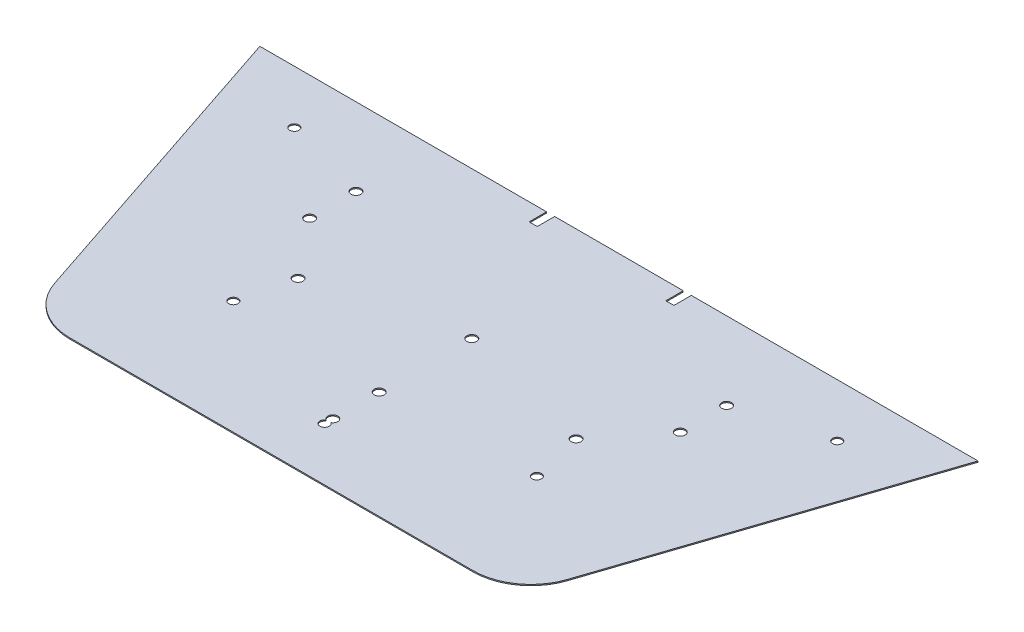
ISO-10303-21;
HEADER;
FILE_DESCRIPTION(('STEP AP214'),'2;1');
FILE_NAME('part.step','',(''),(''),'','','');
FILE_SCHEMA(('AUTOMOTIVE_DESIGN { 1 0 10303 214 1 1 1 1 }'));
ENDSEC;
DATA;
#1=APPLICATION_CONTEXT('core data for automotive mechanical design processes');
#2=APPLICATION_PROTOCOL_DEFINITION('international standard','automotive_design',2000,#1);
#3=PRODUCT_CONTEXT('',#1,'mechanical');
#4=PRODUCT('Part','Part','',(#3));
#5=PRODUCT_RELATED_PRODUCT_CATEGORY('part','',(#4));
#6=PRODUCT_DEFINITION_FORMATION('','',#4);
#7=PRODUCT_DEFINITION_CONTEXT('part definition',#1,'design');
#8=PRODUCT_DEFINITION('design','',#6,#7);
#9=PRODUCT_DEFINITION_SHAPE('','',#8);
#10=(LENGTH_UNIT() NAMED_UNIT(*) SI_UNIT(.MILLI.,.METRE.));
#11=(NAMED_UNIT(*) PLANE_ANGLE_UNIT() SI_UNIT($,.RADIAN.));
#12=(NAMED_UNIT(*) SI_UNIT($,.STERADIAN.) SOLID_ANGLE_UNIT());
#13=UNCERTAINTY_MEASURE_WITH_UNIT(LENGTH_MEASURE(1.E-05),#10,'distance_accuracy_value','');
#14=(GEOMETRIC_REPRESENTATION_CONTEXT(3) GLOBAL_UNCERTAINTY_ASSIGNED_CONTEXT((#13)) GLOBAL_UNIT_ASSIGNED_CONTEXT((#10,
#11,#12)) REPRESENTATION_CONTEXT('',''));
#15=CARTESIAN_POINT('',(0.,0.,0.));
#16=DIRECTION('',(0.,0.,1.));
#17=DIRECTION('',(1.,0.,0.));
#18=AXIS2_PLACEMENT_3D('',#15,#16,#17);
#19=CARTESIAN_POINT('',(0.,81.1999999999999,900.));
#20=DIRECTION('',(0.,0.,-1.));
#21=DIRECTION('',(-1.,0.,0.));
#22=AXIS2_PLACEMENT_3D('',#19,#20,#21);
#23=PLANE('',#22);
#24=DIRECTION('',(1.,0.,0.));
#25=VECTOR('',#24,1.);
#26=CARTESIAN_POINT('',(0.,80.1999999999999,900.));
#27=LINE('',#26,#25);
#28=CARTESIAN_POINT('',(-173.962038997194,80.1999999999999,900.));
#29=VERTEX_POINT('',#28);
#30=CARTESIAN_POINT('',(173.962038997194,80.1999999999999,900.));
#31=VERTEX_POINT('',#30);
#32=EDGE_CURVE('E207',#29,#31,#27,.T.);
#33=ORIENTED_EDGE('',*,*,#32,.T.);
#34=DIRECTION('',(0.,-1.,0.));
#35=VECTOR('',#34,1.);
#36=CARTESIAN_POINT('',(173.962038997194,81.1999999999999,900.));
#37=LINE('',#36,#35);
#38=CARTESIAN_POINT('',(173.962038997194,81.1999999999999,900.));
#39=VERTEX_POINT('',#38);
#40=EDGE_CURVE('E52',#39,#31,#37,.T.);
#41=ORIENTED_EDGE('',*,*,#40,.F.);
#42=DIRECTION('',(1.,0.,0.));
#43=VECTOR('',#42,1.);
#44=CARTESIAN_POINT('',(0.,81.1999999999999,900.));
#45=LINE('',#44,#43);
#46=CARTESIAN_POINT('',(-173.962038997194,81.1999999999999,900.));
#47=VERTEX_POINT('',#46);
#48=EDGE_CURVE('E447',#47,#39,#45,.T.);
#49=ORIENTED_EDGE('',*,*,#48,.F.);
#50=DIRECTION('',(0.,-1.,0.));
#51=VECTOR('',#50,1.);
#52=CARTESIAN_POINT('',(-173.962038997194,81.1999999999999,900.));
#53=LINE('',#52,#51);
#54=EDGE_CURVE('E187',#47,#29,#53,.T.);
#55=ORIENTED_EDGE('',*,*,#54,.T.);
#56=EDGE_LOOP('',(#33,#41,#49,#55));
#57=FACE_BOUND('',#56,.T.);
#58=ADVANCED_FACE('F43',(#57),#23,.F.);
#59=CARTESIAN_POINT('',(173.962038997194,81.1999999999999,850.));
#60=DIRECTION('',(0.,-1.,0.));
#61=DIRECTION('',(0.,0.,-1.));
#62=AXIS2_PLACEMENT_3D('',#59,#60,#61);
#63=CYLINDRICAL_SURFACE('',#62,50.0000000000002);
#64=CARTESIAN_POINT('',(173.962038997194,80.1999999999999,850.));
#65=DIRECTION('',(0.,1.,0.));
#66=DIRECTION('',(0.,0.,1.));
#67=AXIS2_PLACEMENT_3D('',#64,#65,#66);
#68=CIRCLE('',#67,50.0000000000002);
#69=CARTESIAN_POINT('',(221.39620389972,80.1999999999999,865.811388300842));
#70=VERTEX_POINT('',#69);
#71=EDGE_CURVE('E210',#31,#70,#68,.T.);
#72=ORIENTED_EDGE('',*,*,#71,.T.);
#73=DIRECTION('',(0.,-1.,0.));
#74=VECTOR('',#73,1.);
#75=CARTESIAN_POINT('',(221.39620389972,81.1999999999999,865.811388300842));
#76=LINE('',#75,#74);
#77=CARTESIAN_POINT('',(221.39620389972,81.1999999999999,865.811388300842));
#78=VERTEX_POINT('',#77);
#79=EDGE_CURVE('E260',#78,#70,#76,.T.);
#80=ORIENTED_EDGE('',*,*,#79,.F.);
#81=CARTESIAN_POINT('',(173.962038997194,81.1999999999999,850.));
#82=DIRECTION('',(0.,1.,0.));
#83=DIRECTION('',(0.,0.,1.));
#84=AXIS2_PLACEMENT_3D('',#81,#82,#83);
#85=CIRCLE('',#84,50.0000000000002);
#86=EDGE_CURVE('E128',#39,#78,#85,.T.);
#87=ORIENTED_EDGE('',*,*,#86,.F.);
#88=ORIENTED_EDGE('',*,*,#40,.T.);
#89=EDGE_LOOP('',(#72,#80,#87,#88));
#90=FACE_BOUND('',#89,.T.);
#91=ADVANCED_FACE('F306',(#90),#63,.T.);
#92=CARTESIAN_POINT('',(459.,81.1999999999999,153.));
#93=DIRECTION('',(-0.948683298050514,0.,-0.316227766016837));
#94=DIRECTION('',(-0.316227766016837,0.,0.948683298050514));
#95=AXIS2_PLACEMENT_3D('',#92,#93,#94);
#96=PLANE('',#95);
#97=DIRECTION('',(0.316227766016837,0.,-0.948683298050514));
#98=VECTOR('',#97,1.);
#99=CARTESIAN_POINT('',(459.,80.1999999999999,153.));
#100=LINE('',#99,#98);
#101=CARTESIAN_POINT('',(310.,80.1999999999999,600.));
#102=VERTEX_POINT('',#101);
#103=EDGE_CURVE('E212',#70,#102,#100,.T.);
#104=ORIENTED_EDGE('',*,*,#103,.T.);
#105=DIRECTION('',(0.,-1.,0.));
#106=VECTOR('',#105,1.);
#107=CARTESIAN_POINT('',(310.,81.1999999999999,600.));
#108=LINE('',#107,#106);
#109=CARTESIAN_POINT('',(310.,81.1999999999999,600.));
#110=VERTEX_POINT('',#109);
#111=EDGE_CURVE('E257',#110,#102,#108,.T.);
#112=ORIENTED_EDGE('',*,*,#111,.F.);
#113=DIRECTION('',(0.316227766016837,0.,-0.948683298050514));
#114=VECTOR('',#113,1.);
#115=CARTESIAN_POINT('',(459.,81.1999999999999,153.));
#116=LINE('',#115,#114);
#117=EDGE_CURVE('E446',#78,#110,#116,.T.);
#118=ORIENTED_EDGE('',*,*,#117,.F.);
#119=ORIENTED_EDGE('',*,*,#79,.T.);
#120=EDGE_LOOP('',(#104,#112,#118,#119));
#121=FACE_BOUND('',#120,.T.);
#122=ADVANCED_FACE('F312',(#121),#96,.F.);
#123=CARTESIAN_POINT('',(1.07440937866951E-13,81.1999999999999,600.));
#124=DIRECTION('',(0.,0.,1.));
#125=DIRECTION('',(1.,0.,0.));
#126=AXIS2_PLACEMENT_3D('',#123,#124,#125);
#127=PLANE('',#126);
#128=DIRECTION('',(-1.,0.,0.));
#129=VECTOR('',#128,1.);
#130=CARTESIAN_POINT('',(1.07440937866951E-13,80.1999999999999,600.));
#131=LINE('',#130,#129);
#132=CARTESIAN_POINT('',(62.5,80.1999999999999,600.));
#133=VERTEX_POINT('',#132);
#134=EDGE_CURVE('E214',#102,#133,#131,.T.);
#135=ORIENTED_EDGE('',*,*,#134,.T.);
#136=DIRECTION('',(0.,-1.,0.));
#137=VECTOR('',#136,1.);
#138=CARTESIAN_POINT('',(62.5,81.1999999999999,600.));
#139=LINE('',#138,#137);
#140=CARTESIAN_POINT('',(62.5,81.1999999999999,600.));
#141=VERTEX_POINT('',#140);
#142=EDGE_CURVE('E254',#141,#133,#139,.T.);
#143=ORIENTED_EDGE('',*,*,#142,.F.);
#144=DIRECTION('',(-1.,0.,0.));
#145=VECTOR('',#144,1.);
#146=CARTESIAN_POINT('',(1.07440937866951E-13,81.1999999999999,600.));
#147=LINE('',#146,#145);
#148=EDGE_CURVE('E173',#110,#141,#147,.T.);
#149=ORIENTED_EDGE('',*,*,#148,.F.);
#150=ORIENTED_EDGE('',*,*,#111,.T.);
#151=EDGE_LOOP('',(#135,#143,#149,#150));
#152=FACE_BOUND('',#151,.T.);
#153=ADVANCED_FACE('F378',(#152),#127,.F.);
#154=CARTESIAN_POINT('',(62.5,81.1999999999999,0.));
#155=DIRECTION('',(1.,0.,0.));
#156=DIRECTION('',(0.,0.,-1.));
#157=AXIS2_PLACEMENT_3D('',#154,#155,#156);
#158=PLANE('',#157);
#159=DIRECTION('',(0.,0.,1.));
#160=VECTOR('',#159,1.);
#161=CARTESIAN_POINT('',(62.5,80.1999999999999,0.));
#162=LINE('',#161,#160);
#163=CARTESIAN_POINT('',(62.5,80.1999999999999,615.));
#164=VERTEX_POINT('',#163);
#165=EDGE_CURVE('E216',#133,#164,#162,.T.);
#166=ORIENTED_EDGE('',*,*,#165,.T.);
#167=DIRECTION('',(0.,-1.,0.));
#168=VECTOR('',#167,1.);
#169=CARTESIAN_POINT('',(62.5,81.1999999999999,615.));
#170=LINE('',#169,#168);
#171=CARTESIAN_POINT('',(62.5,81.1999999999999,615.));
#172=VERTEX_POINT('',#171);
#173=EDGE_CURVE('E251',#172,#164,#170,.T.);
#174=ORIENTED_EDGE('',*,*,#173,.F.);
#175=DIRECTION('',(0.,0.,1.));
#176=VECTOR('',#175,1.);
#177=CARTESIAN_POINT('',(62.5,81.1999999999999,0.));
#178=LINE('',#177,#176);
#179=EDGE_CURVE('E426',#141,#172,#178,.T.);
#180=ORIENTED_EDGE('',*,*,#179,.F.);
#181=ORIENTED_EDGE('',*,*,#142,.T.);
#182=EDGE_LOOP('',(#166,#174,#180,#181));
#183=FACE_BOUND('',#182,.T.);
#184=ADVANCED_FACE('F398',(#183),#158,.F.);
#185=CARTESIAN_POINT('',(0.,81.1999999999999,615.));
#186=DIRECTION('',(0.,0.,1.));
#187=DIRECTION('',(1.,0.,0.));
#188=AXIS2_PLACEMENT_3D('',#185,#186,#187);
#189=PLANE('',#188);
#190=DIRECTION('',(-1.,0.,0.));
#191=VECTOR('',#190,1.);
#192=CARTESIAN_POINT('',(0.,80.1999999999999,615.));
#193=LINE('',#192,#191);
#194=CARTESIAN_POINT('',(55.5,80.1999999999999,615.));
#195=VERTEX_POINT('',#194);
#196=EDGE_CURVE('E219',#164,#195,#193,.T.);
#197=ORIENTED_EDGE('',*,*,#196,.T.);
#198=DIRECTION('',(0.,-1.,0.));
#199=VECTOR('',#198,1.);
#200=CARTESIAN_POINT('',(55.5,81.1999999999999,615.));
#201=LINE('',#200,#199);
#202=CARTESIAN_POINT('',(55.5,81.1999999999999,615.));
#203=VERTEX_POINT('',#202);
#204=EDGE_CURVE('E248',#203,#195,#201,.T.);
#205=ORIENTED_EDGE('',*,*,#204,.F.);
#206=DIRECTION('',(-1.,0.,0.));
#207=VECTOR('',#206,1.);
#208=CARTESIAN_POINT('',(0.,81.1999999999999,615.));
#209=LINE('',#208,#207);
#210=EDGE_CURVE('E423',#172,#203,#209,.T.);
#211=ORIENTED_EDGE('',*,*,#210,.F.);
#212=ORIENTED_EDGE('',*,*,#173,.T.);
#213=EDGE_LOOP('',(#197,#205,#211,#212));
#214=FACE_BOUND('',#213,.T.);
#215=ADVANCED_FACE('F394',(#214),#189,.F.);
#216=CARTESIAN_POINT('',(55.5000000000009,81.1999999999999,1.11022302462516E-13));
#217=DIRECTION('',(-1.,0.,0.));
#218=DIRECTION('',(0.,0.,1.));
#219=AXIS2_PLACEMENT_3D('',#216,#217,#218);
#220=PLANE('',#219);
#221=DIRECTION('',(0.,0.,-1.));
#222=VECTOR('',#221,1.);
#223=CARTESIAN_POINT('',(55.5000000000009,80.1999999999999,1.11022302462516E-13));
#224=LINE('',#223,#222);
#225=CARTESIAN_POINT('',(55.5,80.1999999999999,600.));
#226=VERTEX_POINT('',#225);
#227=EDGE_CURVE('E221',#195,#226,#224,.T.);
#228=ORIENTED_EDGE('',*,*,#227,.T.);
#229=DIRECTION('',(0.,-1.,0.));
#230=VECTOR('',#229,1.);
#231=CARTESIAN_POINT('',(55.5,81.1999999999999,600.));
#232=LINE('',#231,#230);
#233=CARTESIAN_POINT('',(55.5,81.1999999999999,600.));
#234=VERTEX_POINT('',#233);
#235=EDGE_CURVE('E245',#234,#226,#232,.T.);
#236=ORIENTED_EDGE('',*,*,#235,.F.);
#237=DIRECTION('',(0.,0.,-1.));
#238=VECTOR('',#237,1.);
#239=CARTESIAN_POINT('',(55.5000000000009,81.1999999999999,1.11022302462516E-13));
#240=LINE('',#239,#238);
#241=EDGE_CURVE('E425',#203,#234,#240,.T.);
#242=ORIENTED_EDGE('',*,*,#241,.F.);
#243=ORIENTED_EDGE('',*,*,#204,.T.);
#244=EDGE_LOOP('',(#228,#236,#242,#243));
#245=FACE_BOUND('',#244,.T.);
#246=ADVANCED_FACE('F391',(#245),#220,.F.);
#247=CARTESIAN_POINT('',(-55.5,80.1999999999999,600.));
#248=VERTEX_POINT('',#247);
#249=EDGE_CURVE('E217',#226,#248,#131,.T.);
#250=ORIENTED_EDGE('',*,*,#249,.T.);
#251=DIRECTION('',(0.,-1.,0.));
#252=VECTOR('',#251,1.);
#253=CARTESIAN_POINT('',(-55.5,81.1999999999999,600.));
#254=LINE('',#253,#252);
#255=CARTESIAN_POINT('',(-55.5,81.1999999999999,600.));
#256=VERTEX_POINT('',#255);
#257=EDGE_CURVE('E243',#256,#248,#254,.T.);
#258=ORIENTED_EDGE('',*,*,#257,.F.);
#259=EDGE_CURVE('E172',#234,#256,#147,.T.);
#260=ORIENTED_EDGE('',*,*,#259,.F.);
#261=ORIENTED_EDGE('',*,*,#235,.T.);
#262=EDGE_LOOP('',(#250,#258,#260,#261));
#263=FACE_BOUND('',#262,.T.);
#264=ADVANCED_FACE('F379',(#263),#127,.F.);
#265=CARTESIAN_POINT('',(-55.5000000000009,81.1999999999999,1.11022302462516E-13));
#266=DIRECTION('',(-1.,0.,0.));
#267=DIRECTION('',(0.,0.,1.));
#268=AXIS2_PLACEMENT_3D('',#265,#266,#267);
#269=PLANE('',#268);
#270=DIRECTION('',(0.,0.,-1.));
#271=VECTOR('',#270,1.);
#272=CARTESIAN_POINT('',(-55.5000000000009,80.1999999999999,1.11022302462516E-13));
#273=LINE('',#272,#271);
#274=CARTESIAN_POINT('',(-55.5,80.1999999999999,615.));
#275=VERTEX_POINT('',#274);
#276=EDGE_CURVE('E223',#275,#248,#273,.T.);
#277=ORIENTED_EDGE('',*,*,#276,.F.);
#278=DIRECTION('',(0.,-1.,0.));
#279=VECTOR('',#278,1.);
#280=CARTESIAN_POINT('',(-55.5,81.1999999999999,615.));
#281=LINE('',#280,#279);
#282=CARTESIAN_POINT('',(-55.5,81.1999999999999,615.));
#283=VERTEX_POINT('',#282);
#284=EDGE_CURVE('E241',#283,#275,#281,.T.);
#285=ORIENTED_EDGE('',*,*,#284,.F.);
#286=DIRECTION('',(0.,0.,-1.));
#287=VECTOR('',#286,1.);
#288=CARTESIAN_POINT('',(-55.5000000000009,81.1999999999999,1.11022302462516E-13));
#289=LINE('',#288,#287);
#290=EDGE_CURVE('E431',#283,#256,#289,.T.);
#291=ORIENTED_EDGE('',*,*,#290,.T.);
#292=ORIENTED_EDGE('',*,*,#257,.T.);
#293=EDGE_LOOP('',(#277,#285,#291,#292));
#294=FACE_BOUND('',#293,.T.);
#295=ADVANCED_FACE('F386',(#294),#269,.T.);
#296=CARTESIAN_POINT('',(0.,81.1999999999999,615.));
#297=DIRECTION('',(0.,0.,-1.));
#298=DIRECTION('',(-1.,0.,0.));
#299=AXIS2_PLACEMENT_3D('',#296,#297,#298);
#300=PLANE('',#299);
#301=DIRECTION('',(1.,0.,0.));
#302=VECTOR('',#301,1.);
#303=CARTESIAN_POINT('',(0.,80.1999999999999,615.));
#304=LINE('',#303,#302);
#305=CARTESIAN_POINT('',(-62.5,80.1999999999999,615.));
#306=VERTEX_POINT('',#305);
#307=EDGE_CURVE('E226',#306,#275,#304,.T.);
#308=ORIENTED_EDGE('',*,*,#307,.F.);
#309=DIRECTION('',(0.,-1.,0.));
#310=VECTOR('',#309,1.);
#311=CARTESIAN_POINT('',(-62.5,81.1999999999999,615.));
#312=LINE('',#311,#310);
#313=CARTESIAN_POINT('',(-62.5,81.1999999999999,615.));
#314=VERTEX_POINT('',#313);
#315=EDGE_CURVE('E239',#314,#306,#312,.T.);
#316=ORIENTED_EDGE('',*,*,#315,.F.);
#317=DIRECTION('',(1.,0.,0.));
#318=VECTOR('',#317,1.);
#319=CARTESIAN_POINT('',(0.,81.1999999999999,615.));
#320=LINE('',#319,#318);
#321=EDGE_CURVE('E433',#314,#283,#320,.T.);
#322=ORIENTED_EDGE('',*,*,#321,.T.);
#323=ORIENTED_EDGE('',*,*,#284,.T.);
#324=EDGE_LOOP('',(#308,#316,#322,#323));
#325=FACE_BOUND('',#324,.T.);
#326=ADVANCED_FACE('F382',(#325),#300,.T.);
#327=CARTESIAN_POINT('',(-62.5,81.1999999999999,0.));
#328=DIRECTION('',(1.,0.,0.));
#329=DIRECTION('',(0.,0.,-1.));
#330=AXIS2_PLACEMENT_3D('',#327,#328,#329);
#331=PLANE('',#330);
#332=DIRECTION('',(0.,0.,1.));
#333=VECTOR('',#332,1.);
#334=CARTESIAN_POINT('',(-62.5,80.1999999999999,0.));
#335=LINE('',#334,#333);
#336=CARTESIAN_POINT('',(-62.5,80.1999999999999,600.));
#337=VERTEX_POINT('',#336);
#338=EDGE_CURVE('E229',#337,#306,#335,.T.);
#339=ORIENTED_EDGE('',*,*,#338,.F.);
#340=DIRECTION('',(0.,-1.,0.));
#341=VECTOR('',#340,1.);
#342=CARTESIAN_POINT('',(-62.5,81.1999999999999,600.));
#343=LINE('',#342,#341);
#344=CARTESIAN_POINT('',(-62.5,81.1999999999999,600.));
#345=VERTEX_POINT('',#344);
#346=EDGE_CURVE('E182',#345,#337,#343,.T.);
#347=ORIENTED_EDGE('',*,*,#346,.F.);
#348=DIRECTION('',(0.,0.,1.));
#349=VECTOR('',#348,1.);
#350=CARTESIAN_POINT('',(-62.5,81.1999999999999,0.));
#351=LINE('',#350,#349);
#352=EDGE_CURVE('E169',#345,#314,#351,.T.);
#353=ORIENTED_EDGE('',*,*,#352,.T.);
#354=ORIENTED_EDGE('',*,*,#315,.T.);
#355=EDGE_LOOP('',(#339,#347,#353,#354));
#356=FACE_BOUND('',#355,.T.);
#357=ADVANCED_FACE('F377',(#356),#331,.T.);
#358=CARTESIAN_POINT('',(-310.,80.1999999999999,600.));
#359=VERTEX_POINT('',#358);
#360=EDGE_CURVE('E178',#337,#359,#131,.T.);
#361=ORIENTED_EDGE('',*,*,#360,.T.);
#362=DIRECTION('',(0.,-1.,0.));
#363=VECTOR('',#362,1.);
#364=CARTESIAN_POINT('',(-310.,81.1999999999999,600.));
#365=LINE('',#364,#363);
#366=CARTESIAN_POINT('',(-310.,81.1999999999999,600.));
#367=VERTEX_POINT('',#366);
#368=EDGE_CURVE('E175',#367,#359,#365,.T.);
#369=ORIENTED_EDGE('',*,*,#368,.F.);
#370=EDGE_CURVE('E162',#345,#367,#147,.T.);
#371=ORIENTED_EDGE('',*,*,#370,.F.);
#372=ORIENTED_EDGE('',*,*,#346,.T.);
#373=EDGE_LOOP('',(#361,#369,#371,#372));
#374=FACE_BOUND('',#373,.T.);
#375=ADVANCED_FACE('F176',(#374),#127,.F.);
#376=CARTESIAN_POINT('',(-459.,81.1999999999999,153.));
#377=DIRECTION('',(-0.948683298050514,0.,0.316227766016838));
#378=DIRECTION('',(0.316227766016838,0.,0.948683298050514));
#379=AXIS2_PLACEMENT_3D('',#376,#377,#378);
#380=PLANE('',#379);
#381=DIRECTION('',(-0.316227766016838,0.,-0.948683298050514));
#382=VECTOR('',#381,1.);
#383=CARTESIAN_POINT('',(-459.,80.1999999999999,153.));
#384=LINE('',#383,#382);
#385=CARTESIAN_POINT('',(-221.39620389972,80.1999999999999,865.811388300842));
#386=VERTEX_POINT('',#385);
#387=EDGE_CURVE('E232',#386,#359,#384,.T.);
#388=ORIENTED_EDGE('',*,*,#387,.F.);
#389=DIRECTION('',(0.,-1.,0.));
#390=VECTOR('',#389,1.);
#391=CARTESIAN_POINT('',(-221.39620389972,81.1999999999999,865.811388300842));
#392=LINE('',#391,#390);
#393=CARTESIAN_POINT('',(-221.39620389972,81.1999999999999,865.811388300842));
#394=VERTEX_POINT('',#393);
#395=EDGE_CURVE('E183',#394,#386,#392,.T.);
#396=ORIENTED_EDGE('',*,*,#395,.F.);
#397=DIRECTION('',(-0.316227766016838,0.,-0.948683298050514));
#398=VECTOR('',#397,1.);
#399=CARTESIAN_POINT('',(-459.,81.1999999999999,153.));
#400=LINE('',#399,#398);
#401=EDGE_CURVE('E166',#394,#367,#400,.T.);
#402=ORIENTED_EDGE('',*,*,#401,.T.);
#403=ORIENTED_EDGE('',*,*,#368,.T.);
#404=EDGE_LOOP('',(#388,#396,#402,#403));
#405=FACE_BOUND('',#404,.T.);
#406=ADVANCED_FACE('F185',(#405),#380,.T.);
#407=CARTESIAN_POINT('',(-234.343444872569,81.1999999999999,645.875));
#408=DIRECTION('',(0.,-1.,0.));
#409=DIRECTION('',(0.,0.,-1.));
#410=AXIS2_PLACEMENT_3D('',#407,#408,#409);
#411=CYLINDRICAL_SURFACE('',#410,3.99999999999999);
#412=CARTESIAN_POINT('',(-234.343444872569,81.1999999999999,645.875));
#413=DIRECTION('',(0.,1.,0.));
#414=DIRECTION('',(0.,0.,1.));
#415=AXIS2_PLACEMENT_3D('',#412,#413,#414);
#416=CIRCLE('',#415,3.99999999999999);
#417=CARTESIAN_POINT('',(-234.343444872569,81.1999999999999,649.875));
#418=VERTEX_POINT('',#417);
#419=EDGE_CURVE('E451',#418,#418,#416,.T.);
#420=ORIENTED_EDGE('',*,*,#419,.T.);
#421=EDGE_LOOP('',(#420));
#422=FACE_BOUND('',#421,.T.);
#423=CARTESIAN_POINT('',(-234.343444872569,80.1999999999999,645.875));
#424=DIRECTION('',(0.,1.,0.));
#425=DIRECTION('',(0.,0.,1.));
#426=AXIS2_PLACEMENT_3D('',#423,#424,#425);
#427=CIRCLE('',#426,3.99999999999999);
#428=CARTESIAN_POINT('',(-234.343444872569,80.1999999999999,649.875));
#429=VERTEX_POINT('',#428);
#430=EDGE_CURVE('E204',#429,#429,#427,.T.);
#431=ORIENTED_EDGE('',*,*,#430,.F.);
#432=EDGE_LOOP('',(#431));
#433=FACE_BOUND('',#432,.T.);
#434=ADVANCED_FACE('F316',(#422,#433),#411,.F.);
#435=CARTESIAN_POINT('',(234.343444872569,81.1999999999999,645.875));
#436=DIRECTION('',(0.,-1.,0.));
#437=DIRECTION('',(0.,0.,-1.));
#438=AXIS2_PLACEMENT_3D('',#435,#436,#437);
#439=CYLINDRICAL_SURFACE('',#438,3.99999999999999);
#440=CARTESIAN_POINT('',(234.343444872569,81.1999999999999,645.875));
#441=DIRECTION('',(0.,1.,0.));
#442=DIRECTION('',(0.,0.,1.));
#443=AXIS2_PLACEMENT_3D('',#440,#441,#442);
#444=CIRCLE('',#443,3.99999999999999);
#445=CARTESIAN_POINT('',(234.343444872569,81.1999999999999,649.875));
#446=VERTEX_POINT('',#445);
#447=EDGE_CURVE('E454',#446,#446,#444,.T.);
#448=ORIENTED_EDGE('',*,*,#447,.T.);
#449=EDGE_LOOP('',(#448));
#450=FACE_BOUND('',#449,.T.);
#451=CARTESIAN_POINT('',(234.343444872569,80.1999999999999,645.875));
#452=DIRECTION('',(0.,1.,0.));
#453=DIRECTION('',(0.,0.,1.));
#454=AXIS2_PLACEMENT_3D('',#451,#452,#453);
#455=CIRCLE('',#454,3.99999999999999);
#456=CARTESIAN_POINT('',(234.343444872569,80.1999999999999,649.875));
#457=VERTEX_POINT('',#456);
#458=EDGE_CURVE('E201',#457,#457,#455,.T.);
#459=ORIENTED_EDGE('',*,*,#458,.F.);
#460=EDGE_LOOP('',(#459));
#461=FACE_BOUND('',#460,.T.);
#462=ADVANCED_FACE('F319',(#450,#461),#439,.F.);
#463=CARTESIAN_POINT('',(131.008124108823,81.1999999999999,801.865605122316));
#464=DIRECTION('',(0.,-1.,0.));
#465=DIRECTION('',(0.,0.,-1.));
#466=AXIS2_PLACEMENT_3D('',#463,#464,#465);
#467=CYLINDRICAL_SURFACE('',#466,3.99999999999999);
#468=CARTESIAN_POINT('',(131.008124108823,81.1999999999999,801.865605122316));
#469=DIRECTION('',(0.,1.,0.));
#470=DIRECTION('',(0.,0.,1.));
#471=AXIS2_PLACEMENT_3D('',#468,#469,#470);
#472=CIRCLE('',#471,3.99999999999999);
#473=CARTESIAN_POINT('',(131.008124108823,81.1999999999999,805.865605122316));
#474=VERTEX_POINT('',#473);
#475=EDGE_CURVE('E457',#474,#474,#472,.T.);
#476=ORIENTED_EDGE('',*,*,#475,.T.);
#477=EDGE_LOOP('',(#476));
#478=FACE_BOUND('',#477,.T.);
#479=CARTESIAN_POINT('',(131.008124108823,80.1999999999999,801.865605122316));
#480=DIRECTION('',(0.,1.,0.));
#481=DIRECTION('',(0.,0.,1.));
#482=AXIS2_PLACEMENT_3D('',#479,#480,#481);
#483=CIRCLE('',#482,3.99999999999999);
#484=CARTESIAN_POINT('',(131.008124108823,80.1999999999999,805.865605122316));
#485=VERTEX_POINT('',#484);
#486=EDGE_CURVE('E198',#485,#485,#483,.T.);
#487=ORIENTED_EDGE('',*,*,#486,.F.);
#488=EDGE_LOOP('',(#487));
#489=FACE_BOUND('',#488,.T.);
#490=ADVANCED_FACE('F323',(#478,#489),#467,.F.);
#491=CARTESIAN_POINT('',(0.,81.1999999999999,854.125));
#492=DIRECTION('',(0.,-1.,0.));
#493=DIRECTION('',(0.,0.,-1.));
#494=AXIS2_PLACEMENT_3D('',#491,#492,#493);
#495=CYLINDRICAL_SURFACE('',#494,4.);
#496=DIRECTION('',(0.,1.,0.));
#497=VECTOR('',#496,1.);
#498=CARTESIAN_POINT('',(2.07819512956209,76.1999999999998,850.707236842105));
#499=LINE('',#498,#497);
#500=CARTESIAN_POINT('',(2.0781951295621,80.1999999999999,850.707236842105));
#501=VERTEX_POINT('',#500);
#502=CARTESIAN_POINT('',(2.07819512956209,81.1999999999999,850.707236842105));
#503=VERTEX_POINT('',#502);
#504=EDGE_CURVE('E283',#501,#503,#499,.T.);
#505=ORIENTED_EDGE('',*,*,#504,.F.);
#506=CARTESIAN_POINT('',(0.,80.1999999999999,854.125));
#507=DIRECTION('',(0.,1.,0.));
#508=DIRECTION('',(0.,0.,1.));
#509=AXIS2_PLACEMENT_3D('',#506,#507,#508);
#510=CIRCLE('',#509,4.);
#511=CARTESIAN_POINT('',(-2.07819512956203,80.1999999999999,850.707236842105));
#512=VERTEX_POINT('',#511);
#513=EDGE_CURVE('E195',#512,#501,#510,.T.);
#514=ORIENTED_EDGE('',*,*,#513,.F.);
#515=DIRECTION('',(0.,1.,0.));
#516=VECTOR('',#515,1.);
#517=CARTESIAN_POINT('',(-2.07819512956199,76.1999999999998,850.707236842105));
#518=LINE('',#517,#516);
#519=CARTESIAN_POINT('',(-2.07819512956201,81.1999999999999,850.707236842105));
#520=VERTEX_POINT('',#519);
#521=EDGE_CURVE('E60',#520,#512,#518,.F.);
#522=ORIENTED_EDGE('',*,*,#521,.F.);
#523=CARTESIAN_POINT('',(0.,81.1999999999999,854.125));
#524=DIRECTION('',(0.,1.,0.));
#525=DIRECTION('',(0.,0.,1.));
#526=AXIS2_PLACEMENT_3D('',#523,#524,#525);
#527=CIRCLE('',#526,4.);
#528=EDGE_CURVE('E341',#520,#503,#527,.T.);
#529=ORIENTED_EDGE('',*,*,#528,.T.);
#530=EDGE_LOOP('',(#505,#514,#522,#529));
#531=FACE_BOUND('',#530,.T.);
#532=ADVANCED_FACE('F326',(#531),#495,.F.);
#533=CARTESIAN_POINT('',(-131.008124108823,81.1999999999999,801.865605122316));
#534=DIRECTION('',(0.,-1.,0.));
#535=DIRECTION('',(0.,0.,-1.));
#536=AXIS2_PLACEMENT_3D('',#533,#534,#535);
#537=CYLINDRICAL_SURFACE('',#536,4.00000000000005);
#538=CARTESIAN_POINT('',(-131.008124108823,81.1999999999999,801.865605122316));
#539=DIRECTION('',(0.,1.,0.));
#540=DIRECTION('',(0.,0.,1.));
#541=AXIS2_PLACEMENT_3D('',#538,#539,#540);
#542=CIRCLE('',#541,4.00000000000005);
#543=CARTESIAN_POINT('',(-131.008124108823,81.1999999999999,805.865605122316));
#544=VERTEX_POINT('',#543);
#545=EDGE_CURVE('E235',#544,#544,#542,.T.);
#546=ORIENTED_EDGE('',*,*,#545,.T.);
#547=EDGE_LOOP('',(#546));
#548=FACE_BOUND('',#547,.T.);
#549=CARTESIAN_POINT('',(-131.008124108823,80.1999999999999,801.865605122316));
#550=DIRECTION('',(0.,1.,0.));
#551=DIRECTION('',(0.,0.,1.));
#552=AXIS2_PLACEMENT_3D('',#549,#550,#551);
#553=CIRCLE('',#552,4.00000000000005);
#554=CARTESIAN_POINT('',(-131.008124108823,80.1999999999999,805.865605122316));
#555=VERTEX_POINT('',#554);
#556=EDGE_CURVE('E192',#555,#555,#553,.T.);
#557=ORIENTED_EDGE('',*,*,#556,.F.);
#558=EDGE_LOOP('',(#557));
#559=FACE_BOUND('',#558,.T.);
#560=ADVANCED_FACE('F45',(#548,#559),#537,.F.);
#561=CARTESIAN_POINT('',(-173.962038997194,81.1999999999999,850.));
#562=DIRECTION('',(0.,-1.,0.));
#563=DIRECTION('',(0.,0.,-1.));
#564=AXIS2_PLACEMENT_3D('',#561,#562,#563);
#565=CYLINDRICAL_SURFACE('',#564,50.0000000000002);
#566=CARTESIAN_POINT('',(-173.962038997194,80.1999999999999,850.));
#567=DIRECTION('',(0.,1.,0.));
#568=DIRECTION('',(0.,0.,1.));
#569=AXIS2_PLACEMENT_3D('',#566,#567,#568);
#570=CIRCLE('',#569,50.0000000000002);
#571=EDGE_CURVE('E119',#386,#29,#570,.T.);
#572=ORIENTED_EDGE('',*,*,#571,.T.);
#573=ORIENTED_EDGE('',*,*,#54,.F.);
#574=CARTESIAN_POINT('',(-173.962038997194,81.1999999999999,850.));
#575=DIRECTION('',(0.,1.,0.));
#576=DIRECTION('',(0.,0.,1.));
#577=AXIS2_PLACEMENT_3D('',#574,#575,#576);
#578=CIRCLE('',#577,50.0000000000002);
#579=EDGE_CURVE('E68',#394,#47,#578,.T.);
#580=ORIENTED_EDGE('',*,*,#579,.F.);
#581=ORIENTED_EDGE('',*,*,#395,.T.);
#582=EDGE_LOOP('',(#572,#573,#580,#581));
#583=FACE_BOUND('',#582,.T.);
#584=ADVANCED_FACE('F333',(#583),#565,.T.);
#585=CARTESIAN_POINT('',(0.,81.1999999999999,0.));
#586=DIRECTION('',(0.,1.,0.));
#587=DIRECTION('',(0.,0.,1.));
#588=AXIS2_PLACEMENT_3D('',#585,#586,#587);
#589=PLANE('',#588);
#590=CARTESIAN_POINT('',(-160.,81.1999999999999,706.999999999999));
#591=DIRECTION('',(0.,1.,0.));
#592=DIRECTION('',(0.,0.,1.));
#593=AXIS2_PLACEMENT_3D('',#590,#591,#592);
#594=CIRCLE('',#593,4.2500000000001);
#595=CARTESIAN_POINT('',(-160.,81.1999999999999,711.25));
#596=VERTEX_POINT('',#595);
#597=EDGE_CURVE('E466',#596,#596,#594,.T.);
#598=ORIENTED_EDGE('',*,*,#597,.F.);
#599=EDGE_LOOP('',(#598));
#600=FACE_BOUND('',#599,.T.);
#601=CARTESIAN_POINT('',(-120.,81.1999999999999,756.999999999999));
#602=DIRECTION('',(0.,1.,0.));
#603=DIRECTION('',(0.,0.,1.));
#604=AXIS2_PLACEMENT_3D('',#601,#602,#603);
#605=CIRCLE('',#604,4.24999999999995);
#606=CARTESIAN_POINT('',(-120.,81.1999999999999,761.249999999999));
#607=VERTEX_POINT('',#606);
#608=EDGE_CURVE('E473',#607,#607,#605,.T.);
#609=ORIENTED_EDGE('',*,*,#608,.F.);
#610=EDGE_LOOP('',(#609));
#611=FACE_BOUND('',#610,.T.);
#612=CARTESIAN_POINT('',(0.,81.1999999999999,806.999999999999));
#613=DIRECTION('',(0.,1.,0.));
#614=DIRECTION('',(0.,0.,1.));
#615=AXIS2_PLACEMENT_3D('',#612,#613,#614);
#616=CIRCLE('',#615,4.24999999999999);
#617=CARTESIAN_POINT('',(0.,81.1999999999999,811.249999999999));
#618=VERTEX_POINT('',#617);
#619=EDGE_CURVE('E469',#618,#618,#616,.T.);
#620=ORIENTED_EDGE('',*,*,#619,.F.);
#621=EDGE_LOOP('',(#620));
#622=FACE_BOUND('',#621,.T.);
#623=CARTESIAN_POINT('',(1.00396173123971E-13,81.1999999999999,846.999999999999));
#624=DIRECTION('',(0.,1.,0.));
#625=DIRECTION('',(0.,0.,1.));
#626=AXIS2_PLACEMENT_3D('',#623,#624,#625);
#627=CIRCLE('',#626,4.25000000000014);
#628=EDGE_CURVE('E467',#503,#520,#627,.T.);
#629=ORIENTED_EDGE('',*,*,#628,.F.);
#630=ORIENTED_EDGE('',*,*,#528,.F.);
#631=EDGE_LOOP('',(#629,#630));
#632=FACE_BOUND('',#631,.T.);
#633=CARTESIAN_POINT('',(0.,81.1999999999999,726.999999999999));
#634=DIRECTION('',(0.,1.,0.));
#635=DIRECTION('',(0.,0.,1.));
#636=AXIS2_PLACEMENT_3D('',#633,#634,#635);
#637=CIRCLE('',#636,4.24999999999994);
#638=CARTESIAN_POINT('',(0.,81.1999999999999,731.249999999999));
#639=VERTEX_POINT('',#638);
#640=EDGE_CURVE('E470',#639,#639,#637,.T.);
#641=ORIENTED_EDGE('',*,*,#640,.F.);
#642=EDGE_LOOP('',(#641));
#643=FACE_BOUND('',#642,.T.);
#644=CARTESIAN_POINT('',(120.,81.1999999999999,756.999999999999));
#645=DIRECTION('',(0.,1.,0.));
#646=DIRECTION('',(0.,0.,-1.));
#647=AXIS2_PLACEMENT_3D('',#644,#645,#646);
#648=CIRCLE('',#647,4.24999999999998);
#649=CARTESIAN_POINT('',(120.,81.1999999999999,752.749999999999));
#650=VERTEX_POINT('',#649);
#651=EDGE_CURVE('E483',#650,#650,#648,.T.);
#652=ORIENTED_EDGE('',*,*,#651,.F.);
#653=EDGE_LOOP('',(#652));
#654=FACE_BOUND('',#653,.T.);
#655=CARTESIAN_POINT('',(160.,81.1999999999999,706.999999999999));
#656=DIRECTION('',(0.,1.,0.));
#657=DIRECTION('',(0.,0.,-1.));
#658=AXIS2_PLACEMENT_3D('',#655,#656,#657);
#659=CIRCLE('',#658,4.25000000000005);
#660=CARTESIAN_POINT('',(160.,81.1999999999999,702.749999999999));
#661=VERTEX_POINT('',#660);
#662=EDGE_CURVE('E480',#661,#661,#659,.T.);
#663=ORIENTED_EDGE('',*,*,#662,.F.);
#664=EDGE_LOOP('',(#663));
#665=FACE_BOUND('',#664,.T.);
#666=CARTESIAN_POINT('',(160.,81.1999999999999,666.999999999999));
#667=DIRECTION('',(0.,1.,0.));
#668=DIRECTION('',(0.,0.,-1.));
#669=AXIS2_PLACEMENT_3D('',#666,#667,#668);
#670=CIRCLE('',#669,4.24999999999988);
#671=CARTESIAN_POINT('',(160.,81.1999999999999,662.75));
#672=VERTEX_POINT('',#671);
#673=EDGE_CURVE('E477',#672,#672,#670,.T.);
#674=ORIENTED_EDGE('',*,*,#673,.F.);
#675=EDGE_LOOP('',(#674));
#676=FACE_BOUND('',#675,.T.);
#677=CARTESIAN_POINT('',(-160.,81.1999999999999,666.999999999999));
#678=DIRECTION('',(0.,1.,0.));
#679=DIRECTION('',(0.,0.,1.));
#680=AXIS2_PLACEMENT_3D('',#677,#678,#679);
#681=CIRCLE('',#680,4.24999999999996);
#682=CARTESIAN_POINT('',(-160.,81.1999999999999,671.249999999999));
#683=VERTEX_POINT('',#682);
#684=EDGE_CURVE('E268',#683,#683,#681,.T.);
#685=ORIENTED_EDGE('',*,*,#684,.F.);
#686=EDGE_LOOP('',(#685));
#687=FACE_BOUND('',#686,.T.);
#688=ORIENTED_EDGE('',*,*,#545,.F.);
#689=EDGE_LOOP('',(#688));
#690=FACE_BOUND('',#689,.T.);
#691=ORIENTED_EDGE('',*,*,#475,.F.);
#692=EDGE_LOOP('',(#691));
#693=FACE_BOUND('',#692,.T.);
#694=ORIENTED_EDGE('',*,*,#447,.F.);
#695=EDGE_LOOP('',(#694));
#696=FACE_BOUND('',#695,.T.);
#697=ORIENTED_EDGE('',*,*,#419,.F.);
#698=EDGE_LOOP('',(#697));
#699=FACE_BOUND('',#698,.T.);
#700=ORIENTED_EDGE('',*,*,#48,.T.);
#701=ORIENTED_EDGE('',*,*,#86,.T.);
#702=ORIENTED_EDGE('',*,*,#117,.T.);
#703=ORIENTED_EDGE('',*,*,#148,.T.);
#704=ORIENTED_EDGE('',*,*,#179,.T.);
#705=ORIENTED_EDGE('',*,*,#210,.T.);
#706=ORIENTED_EDGE('',*,*,#241,.T.);
#707=ORIENTED_EDGE('',*,*,#259,.T.);
#708=ORIENTED_EDGE('',*,*,#290,.F.);
#709=ORIENTED_EDGE('',*,*,#321,.F.);
#710=ORIENTED_EDGE('',*,*,#352,.F.);
#711=ORIENTED_EDGE('',*,*,#370,.T.);
#712=ORIENTED_EDGE('',*,*,#401,.F.);
#713=ORIENTED_EDGE('',*,*,#579,.T.);
#714=EDGE_LOOP('',(#700,#701,#702,#703,#704,#705,#706,#707,#708,#709,#710,#711,#712,#713));
#715=FACE_BOUND('',#714,.T.);
#716=ADVANCED_FACE('F164',(#600,#611,#622,#632,#643,#654,#665,#676,#687,#690,#693,#696,#699,
#715),#589,.T.);
#717=CARTESIAN_POINT('',(0.,80.1999999999999,0.));
#718=DIRECTION('',(0.,1.,0.));
#719=DIRECTION('',(0.,0.,1.));
#720=AXIS2_PLACEMENT_3D('',#717,#718,#719);
#721=PLANE('',#720);
#722=CARTESIAN_POINT('',(-160.,80.1999999999999,706.999999999999));
#723=DIRECTION('',(0.,1.,0.));
#724=DIRECTION('',(0.,0.,1.));
#725=AXIS2_PLACEMENT_3D('',#722,#723,#724);
#726=CIRCLE('',#725,4.2500000000001);
#727=CARTESIAN_POINT('',(-160.,80.1999999999999,711.25));
#728=VERTEX_POINT('',#727);
#729=EDGE_CURVE('E47',#728,#728,#726,.T.);
#730=ORIENTED_EDGE('',*,*,#729,.T.);
#731=EDGE_LOOP('',(#730));
#732=FACE_BOUND('',#731,.T.);
#733=CARTESIAN_POINT('',(-120.,80.1999999999999,756.999999999999));
#734=DIRECTION('',(0.,1.,0.));
#735=DIRECTION('',(0.,0.,1.));
#736=AXIS2_PLACEMENT_3D('',#733,#734,#735);
#737=CIRCLE('',#736,4.24999999999995);
#738=CARTESIAN_POINT('',(-120.,80.1999999999999,761.249999999999));
#739=VERTEX_POINT('',#738);
#740=EDGE_CURVE('E282',#739,#739,#737,.T.);
#741=ORIENTED_EDGE('',*,*,#740,.T.);
#742=EDGE_LOOP('',(#741));
#743=FACE_BOUND('',#742,.T.);
#744=CARTESIAN_POINT('',(0.,80.1999999999999,806.999999999999));
#745=DIRECTION('',(0.,1.,0.));
#746=DIRECTION('',(0.,0.,1.));
#747=AXIS2_PLACEMENT_3D('',#744,#745,#746);
#748=CIRCLE('',#747,4.24999999999999);
#749=CARTESIAN_POINT('',(0.,80.1999999999999,811.249999999999));
#750=VERTEX_POINT('',#749);
#751=EDGE_CURVE('E280',#750,#750,#748,.T.);
#752=ORIENTED_EDGE('',*,*,#751,.T.);
#753=EDGE_LOOP('',(#752));
#754=FACE_BOUND('',#753,.T.);
#755=CARTESIAN_POINT('',(0.,80.1999999999999,726.999999999999));
#756=DIRECTION('',(0.,1.,0.));
#757=DIRECTION('',(0.,0.,1.));
#758=AXIS2_PLACEMENT_3D('',#755,#756,#757);
#759=CIRCLE('',#758,4.24999999999994);
#760=CARTESIAN_POINT('',(0.,80.1999999999999,731.249999999999));
#761=VERTEX_POINT('',#760);
#762=EDGE_CURVE('E277',#761,#761,#759,.T.);
#763=ORIENTED_EDGE('',*,*,#762,.T.);
#764=EDGE_LOOP('',(#763));
#765=FACE_BOUND('',#764,.T.);
#766=CARTESIAN_POINT('',(120.,80.1999999999999,756.999999999999));
#767=DIRECTION('',(0.,1.,0.));
#768=DIRECTION('',(0.,0.,1.));
#769=AXIS2_PLACEMENT_3D('',#766,#767,#768);
#770=CIRCLE('',#769,4.24999999999998);
#771=CARTESIAN_POINT('',(120.,80.1999999999999,761.249999999999));
#772=VERTEX_POINT('',#771);
#773=EDGE_CURVE('E274',#772,#772,#770,.T.);
#774=ORIENTED_EDGE('',*,*,#773,.T.);
#775=EDGE_LOOP('',(#774));
#776=FACE_BOUND('',#775,.T.);
#777=CARTESIAN_POINT('',(160.,80.1999999999999,706.999999999999));
#778=DIRECTION('',(0.,1.,0.));
#779=DIRECTION('',(0.,0.,1.));
#780=AXIS2_PLACEMENT_3D('',#777,#778,#779);
#781=CIRCLE('',#780,4.25000000000005);
#782=CARTESIAN_POINT('',(160.,80.1999999999999,711.25));
#783=VERTEX_POINT('',#782);
#784=EDGE_CURVE('E271',#783,#783,#781,.T.);
#785=ORIENTED_EDGE('',*,*,#784,.T.);
#786=EDGE_LOOP('',(#785));
#787=FACE_BOUND('',#786,.T.);
#788=CARTESIAN_POINT('',(160.,80.1999999999999,666.999999999999));
#789=DIRECTION('',(0.,1.,0.));
#790=DIRECTION('',(0.,0.,1.));
#791=AXIS2_PLACEMENT_3D('',#788,#789,#790);
#792=CIRCLE('',#791,4.24999999999988);
#793=CARTESIAN_POINT('',(160.,80.1999999999999,671.249999999999));
#794=VERTEX_POINT('',#793);
#795=EDGE_CURVE('E267',#794,#794,#792,.T.);
#796=ORIENTED_EDGE('',*,*,#795,.T.);
#797=EDGE_LOOP('',(#796));
#798=FACE_BOUND('',#797,.T.);
#799=CARTESIAN_POINT('',(-160.,80.1999999999999,666.999999999999));
#800=DIRECTION('',(0.,1.,0.));
#801=DIRECTION('',(0.,0.,1.));
#802=AXIS2_PLACEMENT_3D('',#799,#800,#801);
#803=CIRCLE('',#802,4.24999999999996);
#804=CARTESIAN_POINT('',(-160.,80.1999999999999,671.249999999999));
#805=VERTEX_POINT('',#804);
#806=EDGE_CURVE('E264',#805,#805,#803,.T.);
#807=ORIENTED_EDGE('',*,*,#806,.T.);
#808=EDGE_LOOP('',(#807));
#809=FACE_BOUND('',#808,.T.);
#810=ORIENTED_EDGE('',*,*,#556,.T.);
#811=EDGE_LOOP('',(#810));
#812=FACE_BOUND('',#811,.T.);
#813=ORIENTED_EDGE('',*,*,#513,.T.);
#814=CARTESIAN_POINT('',(1.00396173123971E-13,80.1999999999999,846.999999999999));
#815=DIRECTION('',(0.,1.,0.));
#816=DIRECTION('',(0.,0.,1.));
#817=AXIS2_PLACEMENT_3D('',#814,#815,#816);
#818=CIRCLE('',#817,4.25000000000014);
#819=EDGE_CURVE('E11',#501,#512,#818,.T.);
#820=ORIENTED_EDGE('',*,*,#819,.T.);
#821=EDGE_LOOP('',(#813,#820));
#822=FACE_BOUND('',#821,.T.);
#823=ORIENTED_EDGE('',*,*,#486,.T.);
#824=EDGE_LOOP('',(#823));
#825=FACE_BOUND('',#824,.T.);
#826=ORIENTED_EDGE('',*,*,#458,.T.);
#827=EDGE_LOOP('',(#826));
#828=FACE_BOUND('',#827,.T.);
#829=ORIENTED_EDGE('',*,*,#430,.T.);
#830=EDGE_LOOP('',(#829));
#831=FACE_BOUND('',#830,.T.);
#832=ORIENTED_EDGE('',*,*,#32,.F.);
#833=ORIENTED_EDGE('',*,*,#571,.F.);
#834=ORIENTED_EDGE('',*,*,#387,.T.);
#835=ORIENTED_EDGE('',*,*,#360,.F.);
#836=ORIENTED_EDGE('',*,*,#338,.T.);
#837=ORIENTED_EDGE('',*,*,#307,.T.);
#838=ORIENTED_EDGE('',*,*,#276,.T.);
#839=ORIENTED_EDGE('',*,*,#249,.F.);
#840=ORIENTED_EDGE('',*,*,#227,.F.);
#841=ORIENTED_EDGE('',*,*,#196,.F.);
#842=ORIENTED_EDGE('',*,*,#165,.F.);
#843=ORIENTED_EDGE('',*,*,#134,.F.);
#844=ORIENTED_EDGE('',*,*,#103,.F.);
#845=ORIENTED_EDGE('',*,*,#71,.F.);
#846=EDGE_LOOP('',(#832,#833,#834,#835,#836,#837,#838,#839,#840,#841,#842,#843,#844,#845));
#847=FACE_BOUND('',#846,.T.);
#848=ADVANCED_FACE('F290',(#732,#743,#754,#765,#776,#787,#798,#809,#812,#822,#825,#828,#831,
#847),#721,.F.);
#849=CARTESIAN_POINT('',(-160.,71.1999999999999,666.999999999999));
#850=DIRECTION('',(0.,1.,0.));
#851=DIRECTION('',(0.,0.,1.));
#852=AXIS2_PLACEMENT_3D('',#849,#850,#851);
#853=CYLINDRICAL_SURFACE('',#852,4.24999999999996);
#854=ORIENTED_EDGE('',*,*,#684,.T.);
#855=EDGE_LOOP('',(#854));
#856=FACE_BOUND('',#855,.T.);
#857=ORIENTED_EDGE('',*,*,#806,.F.);
#858=EDGE_LOOP('',(#857));
#859=FACE_BOUND('',#858,.T.);
#860=ADVANCED_FACE('F361',(#856,#859),#853,.F.);
#861=CARTESIAN_POINT('',(160.,71.1999999999999,666.999999999999));
#862=DIRECTION('',(0.,1.,0.));
#863=DIRECTION('',(0.,0.,1.));
#864=AXIS2_PLACEMENT_3D('',#861,#862,#863);
#865=CYLINDRICAL_SURFACE('',#864,4.24999999999988);
#866=ORIENTED_EDGE('',*,*,#673,.T.);
#867=EDGE_LOOP('',(#866));
#868=FACE_BOUND('',#867,.T.);
#869=ORIENTED_EDGE('',*,*,#795,.F.);
#870=EDGE_LOOP('',(#869));
#871=FACE_BOUND('',#870,.T.);
#872=ADVANCED_FACE('F364',(#868,#871),#865,.F.);
#873=CARTESIAN_POINT('',(160.,71.1999999999999,706.999999999999));
#874=DIRECTION('',(0.,1.,0.));
#875=DIRECTION('',(0.,0.,1.));
#876=AXIS2_PLACEMENT_3D('',#873,#874,#875);
#877=CYLINDRICAL_SURFACE('',#876,4.25000000000005);
#878=ORIENTED_EDGE('',*,*,#662,.T.);
#879=EDGE_LOOP('',(#878));
#880=FACE_BOUND('',#879,.T.);
#881=ORIENTED_EDGE('',*,*,#784,.F.);
#882=EDGE_LOOP('',(#881));
#883=FACE_BOUND('',#882,.T.);
#884=ADVANCED_FACE('F523',(#880,#883),#877,.F.);
#885=CARTESIAN_POINT('',(120.,71.1999999999999,756.999999999999));
#886=DIRECTION('',(0.,1.,0.));
#887=DIRECTION('',(0.,0.,1.));
#888=AXIS2_PLACEMENT_3D('',#885,#886,#887);
#889=CYLINDRICAL_SURFACE('',#888,4.24999999999998);
#890=ORIENTED_EDGE('',*,*,#651,.T.);
#891=EDGE_LOOP('',(#890));
#892=FACE_BOUND('',#891,.T.);
#893=ORIENTED_EDGE('',*,*,#773,.F.);
#894=EDGE_LOOP('',(#893));
#895=FACE_BOUND('',#894,.T.);
#896=ADVANCED_FACE('F357',(#892,#895),#889,.F.);
#897=CARTESIAN_POINT('',(0.,71.1999999999999,726.999999999999));
#898=DIRECTION('',(0.,1.,0.));
#899=DIRECTION('',(0.,0.,1.));
#900=AXIS2_PLACEMENT_3D('',#897,#898,#899);
#901=CYLINDRICAL_SURFACE('',#900,4.24999999999994);
#902=ORIENTED_EDGE('',*,*,#640,.T.);
#903=EDGE_LOOP('',(#902));
#904=FACE_BOUND('',#903,.T.);
#905=ORIENTED_EDGE('',*,*,#762,.F.);
#906=EDGE_LOOP('',(#905));
#907=FACE_BOUND('',#906,.T.);
#908=ADVANCED_FACE('F349',(#904,#907),#901,.F.);
#909=CARTESIAN_POINT('',(1.00396173123971E-13,71.1999999999999,846.999999999999));
#910=DIRECTION('',(0.,1.,0.));
#911=DIRECTION('',(0.,0.,1.));
#912=AXIS2_PLACEMENT_3D('',#909,#910,#911);
#913=CYLINDRICAL_SURFACE('',#912,4.25000000000014);
#914=ORIENTED_EDGE('',*,*,#504,.T.);
#915=ORIENTED_EDGE('',*,*,#628,.T.);
#916=ORIENTED_EDGE('',*,*,#521,.T.);
#917=ORIENTED_EDGE('',*,*,#819,.F.);
#918=EDGE_LOOP('',(#914,#915,#916,#917));
#919=FACE_BOUND('',#918,.T.);
#920=ADVANCED_FACE('F347',(#919),#913,.F.);
#921=CARTESIAN_POINT('',(0.,71.1999999999999,806.999999999999));
#922=DIRECTION('',(0.,1.,0.));
#923=DIRECTION('',(0.,0.,1.));
#924=AXIS2_PLACEMENT_3D('',#921,#922,#923);
#925=CYLINDRICAL_SURFACE('',#924,4.24999999999999);
#926=ORIENTED_EDGE('',*,*,#619,.T.);
#927=EDGE_LOOP('',(#926));
#928=FACE_BOUND('',#927,.T.);
#929=ORIENTED_EDGE('',*,*,#751,.F.);
#930=EDGE_LOOP('',(#929));
#931=FACE_BOUND('',#930,.T.);
#932=ADVANCED_FACE('F300',(#928,#931),#925,.F.);
#933=CARTESIAN_POINT('',(-120.,71.1999999999999,756.999999999999));
#934=DIRECTION('',(0.,1.,0.));
#935=DIRECTION('',(0.,0.,1.));
#936=AXIS2_PLACEMENT_3D('',#933,#934,#935);
#937=CYLINDRICAL_SURFACE('',#936,4.24999999999995);
#938=ORIENTED_EDGE('',*,*,#608,.T.);
#939=EDGE_LOOP('',(#938));
#940=FACE_BOUND('',#939,.T.);
#941=ORIENTED_EDGE('',*,*,#740,.F.);
#942=EDGE_LOOP('',(#941));
#943=FACE_BOUND('',#942,.T.);
#944=ADVANCED_FACE('F294',(#940,#943),#937,.F.);
#945=CARTESIAN_POINT('',(-160.,71.1999999999999,706.999999999999));
#946=DIRECTION('',(0.,1.,0.));
#947=DIRECTION('',(0.,0.,1.));
#948=AXIS2_PLACEMENT_3D('',#945,#946,#947);
#949=CYLINDRICAL_SURFACE('',#948,4.2500000000001);
#950=ORIENTED_EDGE('',*,*,#597,.T.);
#951=EDGE_LOOP('',(#950));
#952=FACE_BOUND('',#951,.T.);
#953=ORIENTED_EDGE('',*,*,#729,.F.);
#954=EDGE_LOOP('',(#953));
#955=FACE_BOUND('',#954,.T.);
#956=ADVANCED_FACE('F292',(#952,#955),#949,.F.);
#957=CLOSED_SHELL('',(#58,#91,#122,#153,#184,#215,#246,#264,#295,#326,#357,#375,#406,#434,#462,
#490,#532,#560,#584,#716,#848,#860,#872,#884,#896,#908,#920,#932,#944,#956));
#958=MANIFOLD_SOLID_BREP('B2',#957);
#959=ADVANCED_BREP_SHAPE_REPRESENTATION('',(#18,#958),#14);
#960=SHAPE_DEFINITION_REPRESENTATION(#9,#959);
ENDSEC;
END-ISO-10303-21;
